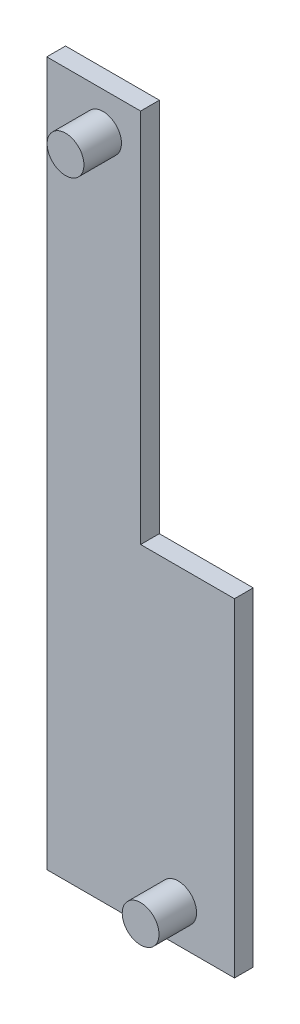
ISO-10303-21;
HEADER;
FILE_DESCRIPTION(('STEP AP214'),'2;1');
FILE_NAME('part.step','',(''),(''),'','','');
FILE_SCHEMA(('AUTOMOTIVE_DESIGN { 1 0 10303 214 1 1 1 1 }'));
ENDSEC;
DATA;
#1=APPLICATION_CONTEXT('core data for automotive mechanical design processes');
#2=APPLICATION_PROTOCOL_DEFINITION('international standard','automotive_design',2000,#1);
#3=PRODUCT_CONTEXT('',#1,'mechanical');
#4=PRODUCT('Part','Part','',(#3));
#5=PRODUCT_RELATED_PRODUCT_CATEGORY('part','',(#4));
#6=PRODUCT_DEFINITION_FORMATION('','',#4);
#7=PRODUCT_DEFINITION_CONTEXT('part definition',#1,'design');
#8=PRODUCT_DEFINITION('design','',#6,#7);
#9=PRODUCT_DEFINITION_SHAPE('','',#8);
#10=(LENGTH_UNIT() NAMED_UNIT(*) SI_UNIT(.MILLI.,.METRE.));
#11=(NAMED_UNIT(*) PLANE_ANGLE_UNIT() SI_UNIT($,.RADIAN.));
#12=(NAMED_UNIT(*) SI_UNIT($,.STERADIAN.) SOLID_ANGLE_UNIT());
#13=UNCERTAINTY_MEASURE_WITH_UNIT(LENGTH_MEASURE(1.E-05),#10,'distance_accuracy_value','');
#14=(GEOMETRIC_REPRESENTATION_CONTEXT(3) GLOBAL_UNCERTAINTY_ASSIGNED_CONTEXT((#13)) GLOBAL_UNIT_ASSIGNED_CONTEXT((#10,
#11,#12)) REPRESENTATION_CONTEXT('',''));
#15=CARTESIAN_POINT('',(0.,0.,0.));
#16=DIRECTION('',(0.,0.,1.));
#17=DIRECTION('',(1.,0.,0.));
#18=AXIS2_PLACEMENT_3D('',#15,#16,#17);
#19=CARTESIAN_POINT('',(0.,0.,5.));
#20=DIRECTION('',(1.,0.,0.));
#21=DIRECTION('',(0.,1.,0.));
#22=AXIS2_PLACEMENT_3D('',#19,#20,#21);
#23=PLANE('',#22);
#24=DIRECTION('',(0.,-1.,0.));
#25=VECTOR('',#24,1.);
#26=CARTESIAN_POINT('',(0.,0.,0.));
#27=LINE('',#26,#25);
#28=CARTESIAN_POINT('',(0.,187.5,0.));
#29=VERTEX_POINT('',#28);
#30=CARTESIAN_POINT('',(0.,0.,0.));
#31=VERTEX_POINT('',#30);
#32=EDGE_CURVE('E118',#29,#31,#27,.T.);
#33=ORIENTED_EDGE('',*,*,#32,.T.);
#34=DIRECTION('',(0.,0.,-1.));
#35=VECTOR('',#34,1.);
#36=CARTESIAN_POINT('',(0.,0.,5.));
#37=LINE('',#36,#35);
#38=CARTESIAN_POINT('',(0.,0.,5.));
#39=VERTEX_POINT('',#38);
#40=EDGE_CURVE('E137',#39,#31,#37,.T.);
#41=ORIENTED_EDGE('',*,*,#40,.F.);
#42=DIRECTION('',(0.,-1.,0.));
#43=VECTOR('',#42,1.);
#44=CARTESIAN_POINT('',(0.,0.,5.));
#45=LINE('',#44,#43);
#46=CARTESIAN_POINT('',(0.,187.5,5.));
#47=VERTEX_POINT('',#46);
#48=EDGE_CURVE('E119',#47,#39,#45,.T.);
#49=ORIENTED_EDGE('',*,*,#48,.F.);
#50=DIRECTION('',(0.,0.,-1.));
#51=VECTOR('',#50,1.);
#52=CARTESIAN_POINT('',(0.,187.5,5.));
#53=LINE('',#52,#51);
#54=EDGE_CURVE('E124',#47,#29,#53,.T.);
#55=ORIENTED_EDGE('',*,*,#54,.T.);
#56=EDGE_LOOP('',(#33,#41,#49,#55));
#57=FACE_BOUND('',#56,.T.);
#58=ADVANCED_FACE('F32',(#57),#23,.F.);
#59=CARTESIAN_POINT('',(0.,0.,5.));
#60=DIRECTION('',(0.,1.,0.));
#61=DIRECTION('',(0.,0.,1.));
#62=AXIS2_PLACEMENT_3D('',#59,#60,#61);
#63=PLANE('',#62);
#64=DIRECTION('',(1.,0.,0.));
#65=VECTOR('',#64,1.);
#66=CARTESIAN_POINT('',(0.,0.,0.));
#67=LINE('',#66,#65);
#68=CARTESIAN_POINT('',(50.,0.,0.));
#69=VERTEX_POINT('',#68);
#70=EDGE_CURVE('E127',#31,#69,#67,.T.);
#71=ORIENTED_EDGE('',*,*,#70,.T.);
#72=DIRECTION('',(0.,0.,-1.));
#73=VECTOR('',#72,1.);
#74=CARTESIAN_POINT('',(50.,0.,5.));
#75=LINE('',#74,#73);
#76=CARTESIAN_POINT('',(50.,0.,5.));
#77=VERTEX_POINT('',#76);
#78=EDGE_CURVE('E134',#77,#69,#75,.T.);
#79=ORIENTED_EDGE('',*,*,#78,.F.);
#80=DIRECTION('',(1.,0.,0.));
#81=VECTOR('',#80,1.);
#82=CARTESIAN_POINT('',(0.,0.,5.));
#83=LINE('',#82,#81);
#84=EDGE_CURVE('E79',#39,#77,#83,.T.);
#85=ORIENTED_EDGE('',*,*,#84,.F.);
#86=ORIENTED_EDGE('',*,*,#40,.T.);
#87=EDGE_LOOP('',(#71,#79,#85,#86));
#88=FACE_BOUND('',#87,.T.);
#89=ADVANCED_FACE('F170',(#88),#63,.F.);
#90=CARTESIAN_POINT('',(50.,0.,5.));
#91=DIRECTION('',(-1.,0.,0.));
#92=DIRECTION('',(0.,-1.,0.));
#93=AXIS2_PLACEMENT_3D('',#90,#91,#92);
#94=PLANE('',#93);
#95=DIRECTION('',(0.,1.,0.));
#96=VECTOR('',#95,1.);
#97=CARTESIAN_POINT('',(50.,0.,0.));
#98=LINE('',#97,#96);
#99=CARTESIAN_POINT('',(50.,87.5,0.));
#100=VERTEX_POINT('',#99);
#101=EDGE_CURVE('E129',#69,#100,#98,.T.);
#102=ORIENTED_EDGE('',*,*,#101,.T.);
#103=DIRECTION('',(0.,0.,1.));
#104=VECTOR('',#103,1.);
#105=CARTESIAN_POINT('',(50.,87.5,-5.));
#106=LINE('',#105,#104);
#107=CARTESIAN_POINT('',(50.,87.5,5.));
#108=VERTEX_POINT('',#107);
#109=EDGE_CURVE('E46',#100,#108,#106,.T.);
#110=ORIENTED_EDGE('',*,*,#109,.T.);
#111=DIRECTION('',(0.,1.,0.));
#112=VECTOR('',#111,1.);
#113=CARTESIAN_POINT('',(50.,0.,5.));
#114=LINE('',#113,#112);
#115=EDGE_CURVE('E107',#77,#108,#114,.T.);
#116=ORIENTED_EDGE('',*,*,#115,.F.);
#117=ORIENTED_EDGE('',*,*,#78,.T.);
#118=EDGE_LOOP('',(#102,#110,#116,#117));
#119=FACE_BOUND('',#118,.T.);
#120=ADVANCED_FACE('F175',(#119),#94,.F.);
#121=CARTESIAN_POINT('',(0.,187.5,5.));
#122=DIRECTION('',(0.,-1.,0.));
#123=DIRECTION('',(0.,0.,-1.));
#124=AXIS2_PLACEMENT_3D('',#121,#122,#123);
#125=PLANE('',#124);
#126=DIRECTION('',(-1.,0.,0.));
#127=VECTOR('',#126,1.);
#128=CARTESIAN_POINT('',(0.,187.5,5.));
#129=LINE('',#128,#127);
#130=CARTESIAN_POINT('',(25.,187.5,5.));
#131=VERTEX_POINT('',#130);
#132=EDGE_CURVE('E55',#131,#47,#129,.T.);
#133=ORIENTED_EDGE('',*,*,#132,.F.);
#134=DIRECTION('',(0.,0.,1.));
#135=VECTOR('',#134,1.);
#136=CARTESIAN_POINT('',(25.,187.5,-5.));
#137=LINE('',#136,#135);
#138=CARTESIAN_POINT('',(25.,187.5,0.));
#139=VERTEX_POINT('',#138);
#140=EDGE_CURVE('E102',#139,#131,#137,.T.);
#141=ORIENTED_EDGE('',*,*,#140,.F.);
#142=DIRECTION('',(-1.,0.,0.));
#143=VECTOR('',#142,1.);
#144=CARTESIAN_POINT('',(0.,187.5,0.));
#145=LINE('',#144,#143);
#146=EDGE_CURVE('E73',#139,#29,#145,.T.);
#147=ORIENTED_EDGE('',*,*,#146,.T.);
#148=ORIENTED_EDGE('',*,*,#54,.F.);
#149=EDGE_LOOP('',(#133,#141,#147,#148));
#150=FACE_BOUND('',#149,.T.);
#151=ADVANCED_FACE('F151',(#150),#125,.F.);
#152=CARTESIAN_POINT('',(0.,0.,5.));
#153=DIRECTION('',(0.,0.,-1.));
#154=DIRECTION('',(-1.,0.,0.));
#155=AXIS2_PLACEMENT_3D('',#152,#153,#154);
#156=PLANE('',#155);
#157=CARTESIAN_POINT('',(15.,177.5,5.));
#158=DIRECTION('',(0.,0.,-1.));
#159=DIRECTION('',(-1.,0.,0.));
#160=AXIS2_PLACEMENT_3D('',#157,#158,#159);
#161=CIRCLE('',#160,4.89999999999998);
#162=CARTESIAN_POINT('',(10.1,177.5,5.));
#163=VERTEX_POINT('',#162);
#164=EDGE_CURVE('E142',#163,#163,#161,.F.);
#165=ORIENTED_EDGE('',*,*,#164,.F.);
#166=EDGE_LOOP('',(#165));
#167=FACE_BOUND('',#166,.T.);
#168=CARTESIAN_POINT('',(35.,10.,5.));
#169=DIRECTION('',(0.,0.,-1.));
#170=DIRECTION('',(-1.,0.,0.));
#171=AXIS2_PLACEMENT_3D('',#168,#169,#170);
#172=CIRCLE('',#171,4.9);
#173=CARTESIAN_POINT('',(30.1,10.,5.));
#174=VERTEX_POINT('',#173);
#175=EDGE_CURVE('E139',#174,#174,#172,.F.);
#176=ORIENTED_EDGE('',*,*,#175,.F.);
#177=EDGE_LOOP('',(#176));
#178=FACE_BOUND('',#177,.T.);
#179=DIRECTION('',(1.,0.,0.));
#180=VECTOR('',#179,1.);
#181=CARTESIAN_POINT('',(25.,87.5,5.));
#182=LINE('',#181,#180);
#183=CARTESIAN_POINT('',(25.,87.5,5.));
#184=VERTEX_POINT('',#183);
#185=EDGE_CURVE('E96',#184,#108,#182,.T.);
#186=ORIENTED_EDGE('',*,*,#185,.F.);
#187=DIRECTION('',(0.,-1.,0.));
#188=VECTOR('',#187,1.);
#189=CARTESIAN_POINT('',(25.,187.5,5.));
#190=LINE('',#189,#188);
#191=EDGE_CURVE('E100',#131,#184,#190,.T.);
#192=ORIENTED_EDGE('',*,*,#191,.F.);
#193=ORIENTED_EDGE('',*,*,#132,.T.);
#194=ORIENTED_EDGE('',*,*,#48,.T.);
#195=ORIENTED_EDGE('',*,*,#84,.T.);
#196=ORIENTED_EDGE('',*,*,#115,.T.);
#197=EDGE_LOOP('',(#186,#192,#193,#194,#195,#196));
#198=FACE_BOUND('',#197,.T.);
#199=ADVANCED_FACE('F105',(#167,#178,#198),#156,.F.);
#200=CARTESIAN_POINT('',(0.,0.,0.));
#201=DIRECTION('',(0.,0.,-1.));
#202=DIRECTION('',(-1.,0.,0.));
#203=AXIS2_PLACEMENT_3D('',#200,#201,#202);
#204=PLANE('',#203);
#205=DIRECTION('',(0.,1.,0.));
#206=VECTOR('',#205,1.);
#207=CARTESIAN_POINT('',(25.,0.,0.));
#208=LINE('',#207,#206);
#209=CARTESIAN_POINT('',(25.,87.5,0.));
#210=VERTEX_POINT('',#209);
#211=EDGE_CURVE('E11',#210,#139,#208,.T.);
#212=ORIENTED_EDGE('',*,*,#211,.F.);
#213=DIRECTION('',(-1.,0.,0.));
#214=VECTOR('',#213,1.);
#215=CARTESIAN_POINT('',(0.,87.5,0.));
#216=LINE('',#215,#214);
#217=EDGE_CURVE('E39',#100,#210,#216,.T.);
#218=ORIENTED_EDGE('',*,*,#217,.F.);
#219=ORIENTED_EDGE('',*,*,#101,.F.);
#220=ORIENTED_EDGE('',*,*,#70,.F.);
#221=ORIENTED_EDGE('',*,*,#32,.F.);
#222=ORIENTED_EDGE('',*,*,#146,.F.);
#223=EDGE_LOOP('',(#212,#218,#219,#220,#221,#222));
#224=FACE_BOUND('',#223,.T.);
#225=ADVANCED_FACE('F150',(#224),#204,.T.);
#226=CARTESIAN_POINT('',(35.,10.,15.));
#227=DIRECTION('',(0.,0.,-1.));
#228=DIRECTION('',(-1.,0.,0.));
#229=AXIS2_PLACEMENT_3D('',#226,#227,#228);
#230=CYLINDRICAL_SURFACE('',#229,4.9);
#231=CARTESIAN_POINT('',(35.,10.,15.));
#232=DIRECTION('',(0.,0.,1.));
#233=DIRECTION('',(1.,0.,0.));
#234=AXIS2_PLACEMENT_3D('',#231,#232,#233);
#235=CIRCLE('',#234,4.9);
#236=CARTESIAN_POINT('',(39.9,10.,15.));
#237=VERTEX_POINT('',#236);
#238=EDGE_CURVE('E115',#237,#237,#235,.T.);
#239=ORIENTED_EDGE('',*,*,#238,.F.);
#240=EDGE_LOOP('',(#239));
#241=FACE_BOUND('',#240,.T.);
#242=ORIENTED_EDGE('',*,*,#175,.T.);
#243=EDGE_LOOP('',(#242));
#244=FACE_BOUND('',#243,.T.);
#245=ADVANCED_FACE('F155',(#241,#244),#230,.T.);
#246=CARTESIAN_POINT('',(35.,10.,15.));
#247=DIRECTION('',(0.,0.,1.));
#248=DIRECTION('',(1.,0.,0.));
#249=AXIS2_PLACEMENT_3D('',#246,#247,#248);
#250=PLANE('',#249);
#251=ORIENTED_EDGE('',*,*,#238,.T.);
#252=EDGE_LOOP('',(#251));
#253=FACE_BOUND('',#252,.T.);
#254=ADVANCED_FACE('F157',(#253),#250,.T.);
#255=CARTESIAN_POINT('',(15.,177.5,15.));
#256=DIRECTION('',(0.,0.,-1.));
#257=DIRECTION('',(-1.,0.,0.));
#258=AXIS2_PLACEMENT_3D('',#255,#256,#257);
#259=CYLINDRICAL_SURFACE('',#258,4.89999999999998);
#260=CARTESIAN_POINT('',(15.,177.5,15.));
#261=DIRECTION('',(0.,0.,1.));
#262=DIRECTION('',(1.,0.,0.));
#263=AXIS2_PLACEMENT_3D('',#260,#261,#262);
#264=CIRCLE('',#263,4.89999999999998);
#265=CARTESIAN_POINT('',(19.9,177.5,15.));
#266=VERTEX_POINT('',#265);
#267=EDGE_CURVE('E111',#266,#266,#264,.T.);
#268=ORIENTED_EDGE('',*,*,#267,.F.);
#269=EDGE_LOOP('',(#268));
#270=FACE_BOUND('',#269,.T.);
#271=ORIENTED_EDGE('',*,*,#164,.T.);
#272=EDGE_LOOP('',(#271));
#273=FACE_BOUND('',#272,.T.);
#274=ADVANCED_FACE('F146',(#270,#273),#259,.T.);
#275=CARTESIAN_POINT('',(15.,177.5,15.));
#276=DIRECTION('',(0.,0.,1.));
#277=DIRECTION('',(1.,0.,0.));
#278=AXIS2_PLACEMENT_3D('',#275,#276,#277);
#279=PLANE('',#278);
#280=ORIENTED_EDGE('',*,*,#267,.T.);
#281=EDGE_LOOP('',(#280));
#282=FACE_BOUND('',#281,.T.);
#283=ADVANCED_FACE('F207',(#282),#279,.T.);
#284=CARTESIAN_POINT('',(25.,187.5,-5.));
#285=DIRECTION('',(-1.,0.,0.));
#286=DIRECTION('',(0.,-1.,0.));
#287=AXIS2_PLACEMENT_3D('',#284,#285,#286);
#288=PLANE('',#287);
#289=ORIENTED_EDGE('',*,*,#211,.T.);
#290=ORIENTED_EDGE('',*,*,#140,.T.);
#291=ORIENTED_EDGE('',*,*,#191,.T.);
#292=DIRECTION('',(0.,0.,1.));
#293=VECTOR('',#292,1.);
#294=CARTESIAN_POINT('',(25.,87.5,-5.));
#295=LINE('',#294,#293);
#296=EDGE_CURVE('E92',#210,#184,#295,.T.);
#297=ORIENTED_EDGE('',*,*,#296,.F.);
#298=EDGE_LOOP('',(#289,#290,#291,#297));
#299=FACE_BOUND('',#298,.T.);
#300=ADVANCED_FACE('F101',(#299),#288,.F.);
#301=CARTESIAN_POINT('',(25.,87.5,-5.));
#302=DIRECTION('',(0.,-1.,0.));
#303=DIRECTION('',(0.,0.,-1.));
#304=AXIS2_PLACEMENT_3D('',#301,#302,#303);
#305=PLANE('',#304);
#306=ORIENTED_EDGE('',*,*,#217,.T.);
#307=ORIENTED_EDGE('',*,*,#296,.T.);
#308=ORIENTED_EDGE('',*,*,#185,.T.);
#309=ORIENTED_EDGE('',*,*,#109,.F.);
#310=EDGE_LOOP('',(#306,#307,#308,#309));
#311=FACE_BOUND('',#310,.T.);
#312=ADVANCED_FACE('F94',(#311),#305,.F.);
#313=CLOSED_SHELL('',(#58,#89,#120,#151,#199,#225,#245,#254,#274,#283,#300,#312));
#314=MANIFOLD_SOLID_BREP('B2',#313);
#315=ADVANCED_BREP_SHAPE_REPRESENTATION('',(#18,#314),#14);
#316=SHAPE_DEFINITION_REPRESENTATION(#9,#315);
ENDSEC;
END-ISO-10303-21;
